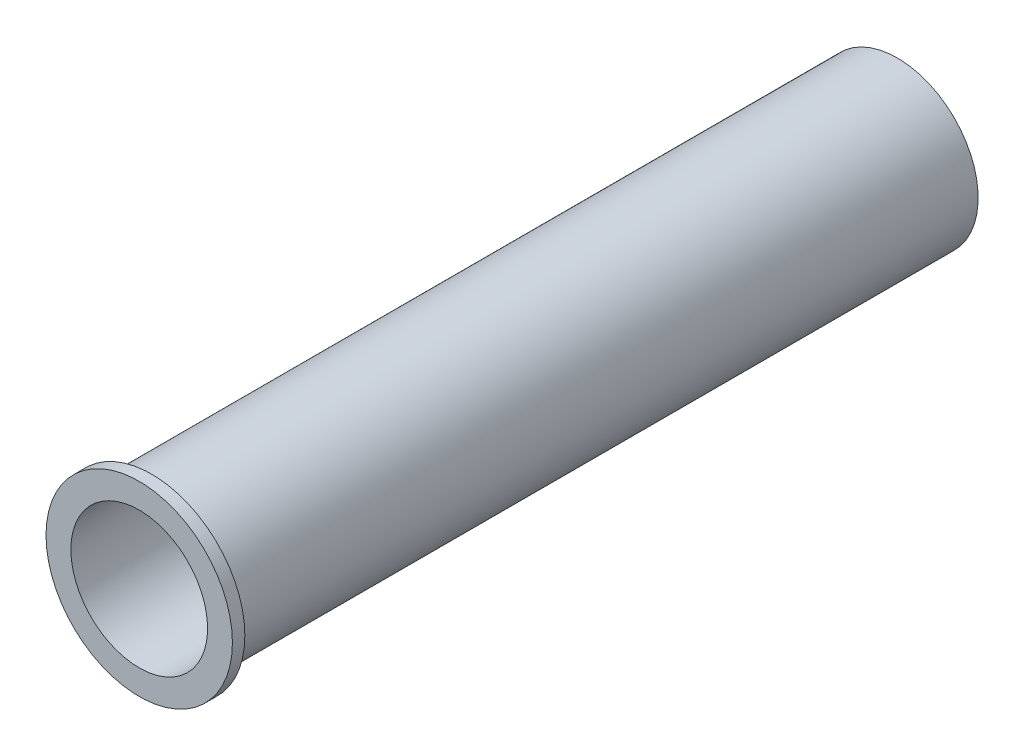
ISO-10303-21;
HEADER;
FILE_DESCRIPTION(('STEP AP214'),'2;1');
FILE_NAME('part.step','',(''),(''),'','','');
FILE_SCHEMA(('AUTOMOTIVE_DESIGN { 1 0 10303 214 1 1 1 1 }'));
ENDSEC;
DATA;
#1=APPLICATION_CONTEXT('core data for automotive mechanical design processes');
#2=APPLICATION_PROTOCOL_DEFINITION('international standard','automotive_design',2000,#1);
#3=PRODUCT_CONTEXT('',#1,'mechanical');
#4=PRODUCT('Part','Part','',(#3));
#5=PRODUCT_RELATED_PRODUCT_CATEGORY('part','',(#4));
#6=PRODUCT_DEFINITION_FORMATION('','',#4);
#7=PRODUCT_DEFINITION_CONTEXT('part definition',#1,'design');
#8=PRODUCT_DEFINITION('design','',#6,#7);
#9=PRODUCT_DEFINITION_SHAPE('','',#8);
#10=(LENGTH_UNIT() NAMED_UNIT(*) SI_UNIT(.MILLI.,.METRE.));
#11=(NAMED_UNIT(*) PLANE_ANGLE_UNIT() SI_UNIT($,.RADIAN.));
#12=(NAMED_UNIT(*) SI_UNIT($,.STERADIAN.) SOLID_ANGLE_UNIT());
#13=UNCERTAINTY_MEASURE_WITH_UNIT(LENGTH_MEASURE(1.E-05),#10,'distance_accuracy_value','');
#14=(GEOMETRIC_REPRESENTATION_CONTEXT(3) GLOBAL_UNCERTAINTY_ASSIGNED_CONTEXT((#13)) GLOBAL_UNIT_ASSIGNED_CONTEXT((#10,
#11,#12)) REPRESENTATION_CONTEXT('',''));
#15=CARTESIAN_POINT('',(0.,0.,0.));
#16=DIRECTION('',(0.,0.,1.));
#17=DIRECTION('',(1.,0.,0.));
#18=AXIS2_PLACEMENT_3D('',#15,#16,#17);
#19=CARTESIAN_POINT('',(0.,0.,0.));
#20=DIRECTION('',(0.,0.,-1.));
#21=DIRECTION('',(-1.,0.,0.));
#22=AXIS2_PLACEMENT_3D('',#19,#20,#21);
#23=CYLINDRICAL_SURFACE('',#22,15.);
#24=CARTESIAN_POINT('',(0.,0.,60.));
#25=DIRECTION('',(0.,0.,-1.));
#26=DIRECTION('',(-1.,0.,0.));
#27=AXIS2_PLACEMENT_3D('',#24,#25,#26);
#28=CIRCLE('',#27,15.);
#29=CARTESIAN_POINT('',(-15.,0.,60.));
#30=VERTEX_POINT('',#29);
#31=EDGE_CURVE('E78',#30,#30,#28,.T.);
#32=ORIENTED_EDGE('',*,*,#31,.T.);
#33=EDGE_LOOP('',(#32));
#34=FACE_BOUND('',#33,.T.);
#35=CARTESIAN_POINT('',(0.,0.,58.));
#36=DIRECTION('',(0.,0.,-1.));
#37=DIRECTION('',(-1.,0.,0.));
#38=AXIS2_PLACEMENT_3D('',#35,#36,#37);
#39=CIRCLE('',#38,15.);
#40=CARTESIAN_POINT('',(-15.,0.,58.));
#41=VERTEX_POINT('',#40);
#42=EDGE_CURVE('E10',#41,#41,#39,.T.);
#43=ORIENTED_EDGE('',*,*,#42,.F.);
#44=EDGE_LOOP('',(#43));
#45=FACE_BOUND('',#44,.T.);
#46=ADVANCED_FACE('F43',(#34,#45),#23,.T.);
#47=CARTESIAN_POINT('',(0.,15.,58.));
#48=DIRECTION('',(0.,0.,-1.));
#49=DIRECTION('',(-1.,0.,0.));
#50=AXIS2_PLACEMENT_3D('',#47,#48,#49);
#51=PLANE('',#50);
#52=ORIENTED_EDGE('',*,*,#42,.T.);
#53=EDGE_LOOP('',(#52));
#54=FACE_BOUND('',#53,.T.);
#55=CARTESIAN_POINT('',(0.,0.,58.));
#56=DIRECTION('',(0.,0.,-1.));
#57=DIRECTION('',(-1.,0.,0.));
#58=AXIS2_PLACEMENT_3D('',#55,#56,#57);
#59=CIRCLE('',#58,13.);
#60=CARTESIAN_POINT('',(-13.,0.,58.));
#61=VERTEX_POINT('',#60);
#62=EDGE_CURVE('E50',#61,#61,#59,.T.);
#63=ORIENTED_EDGE('',*,*,#62,.F.);
#64=EDGE_LOOP('',(#63));
#65=FACE_BOUND('',#64,.T.);
#66=ADVANCED_FACE('F97',(#54,#65),#51,.T.);
#67=CARTESIAN_POINT('',(0.,0.,0.));
#68=DIRECTION('',(0.,0.,-1.));
#69=DIRECTION('',(-1.,0.,0.));
#70=AXIS2_PLACEMENT_3D('',#67,#68,#69);
#71=CYLINDRICAL_SURFACE('',#70,13.);
#72=ORIENTED_EDGE('',*,*,#62,.T.);
#73=EDGE_LOOP('',(#72));
#74=FACE_BOUND('',#73,.T.);
#75=CARTESIAN_POINT('',(0.,0.,-62.));
#76=DIRECTION('',(0.,0.,-1.));
#77=DIRECTION('',(-1.,0.,0.));
#78=AXIS2_PLACEMENT_3D('',#75,#76,#77);
#79=CIRCLE('',#78,13.);
#80=CARTESIAN_POINT('',(-13.,0.,-62.));
#81=VERTEX_POINT('',#80);
#82=EDGE_CURVE('E55',#81,#81,#79,.T.);
#83=ORIENTED_EDGE('',*,*,#82,.F.);
#84=EDGE_LOOP('',(#83));
#85=FACE_BOUND('',#84,.T.);
#86=ADVANCED_FACE('F101',(#74,#85),#71,.T.);
#87=CARTESIAN_POINT('',(0.,13.,-62.));
#88=DIRECTION('',(0.,0.,-1.));
#89=DIRECTION('',(-1.,0.,0.));
#90=AXIS2_PLACEMENT_3D('',#87,#88,#89);
#91=PLANE('',#90);
#92=ORIENTED_EDGE('',*,*,#82,.T.);
#93=EDGE_LOOP('',(#92));
#94=FACE_BOUND('',#93,.T.);
#95=CARTESIAN_POINT('',(0.,0.,-62.));
#96=DIRECTION('',(0.,0.,-1.));
#97=DIRECTION('',(-1.,0.,0.));
#98=AXIS2_PLACEMENT_3D('',#95,#96,#97);
#99=CIRCLE('',#98,9.50000000000001);
#100=CARTESIAN_POINT('',(-9.50000000000001,0.,-62.));
#101=VERTEX_POINT('',#100);
#102=EDGE_CURVE('E60',#101,#101,#99,.T.);
#103=ORIENTED_EDGE('',*,*,#102,.F.);
#104=EDGE_LOOP('',(#103));
#105=FACE_BOUND('',#104,.T.);
#106=ADVANCED_FACE('F105',(#94,#105),#91,.T.);
#107=CARTESIAN_POINT('',(0.,0.,0.));
#108=DIRECTION('',(0.,0.,-1.));
#109=DIRECTION('',(-1.,0.,0.));
#110=AXIS2_PLACEMENT_3D('',#107,#108,#109);
#111=CYLINDRICAL_SURFACE('',#110,9.50000000000001);
#112=ORIENTED_EDGE('',*,*,#102,.T.);
#113=EDGE_LOOP('',(#112));
#114=FACE_BOUND('',#113,.T.);
#115=CARTESIAN_POINT('',(0.,0.,-60.));
#116=DIRECTION('',(0.,0.,-1.));
#117=DIRECTION('',(-1.,0.,0.));
#118=AXIS2_PLACEMENT_3D('',#115,#116,#117);
#119=CIRCLE('',#118,9.50000000000001);
#120=CARTESIAN_POINT('',(-9.50000000000001,0.,-60.));
#121=VERTEX_POINT('',#120);
#122=EDGE_CURVE('E66',#121,#121,#119,.T.);
#123=ORIENTED_EDGE('',*,*,#122,.F.);
#124=EDGE_LOOP('',(#123));
#125=FACE_BOUND('',#124,.T.);
#126=ADVANCED_FACE('F111',(#114,#125),#111,.F.);
#127=CARTESIAN_POINT('',(0.,9.50000000000001,-60.));
#128=DIRECTION('',(0.,0.,1.));
#129=DIRECTION('',(1.,0.,0.));
#130=AXIS2_PLACEMENT_3D('',#127,#128,#129);
#131=PLANE('',#130);
#132=ORIENTED_EDGE('',*,*,#122,.T.);
#133=EDGE_LOOP('',(#132));
#134=FACE_BOUND('',#133,.T.);
#135=CARTESIAN_POINT('',(0.,0.,-60.));
#136=DIRECTION('',(0.,0.,-1.));
#137=DIRECTION('',(-1.,0.,0.));
#138=AXIS2_PLACEMENT_3D('',#135,#136,#137);
#139=CIRCLE('',#138,11.);
#140=CARTESIAN_POINT('',(-11.,0.,-60.));
#141=VERTEX_POINT('',#140);
#142=EDGE_CURVE('E70',#141,#141,#139,.T.);
#143=ORIENTED_EDGE('',*,*,#142,.F.);
#144=EDGE_LOOP('',(#143));
#145=FACE_BOUND('',#144,.T.);
#146=ADVANCED_FACE('F93',(#134,#145),#131,.T.);
#147=CARTESIAN_POINT('',(0.,0.,0.));
#148=DIRECTION('',(0.,0.,-1.));
#149=DIRECTION('',(-1.,0.,0.));
#150=AXIS2_PLACEMENT_3D('',#147,#148,#149);
#151=CYLINDRICAL_SURFACE('',#150,11.);
#152=ORIENTED_EDGE('',*,*,#142,.T.);
#153=EDGE_LOOP('',(#152));
#154=FACE_BOUND('',#153,.T.);
#155=CARTESIAN_POINT('',(0.,0.,60.));
#156=DIRECTION('',(0.,0.,-1.));
#157=DIRECTION('',(-1.,0.,0.));
#158=AXIS2_PLACEMENT_3D('',#155,#156,#157);
#159=CIRCLE('',#158,11.);
#160=CARTESIAN_POINT('',(-11.,0.,60.));
#161=VERTEX_POINT('',#160);
#162=EDGE_CURVE('E74',#161,#161,#159,.T.);
#163=ORIENTED_EDGE('',*,*,#162,.F.);
#164=EDGE_LOOP('',(#163));
#165=FACE_BOUND('',#164,.T.);
#166=ADVANCED_FACE('F87',(#154,#165),#151,.F.);
#167=CARTESIAN_POINT('',(0.,11.,60.));
#168=DIRECTION('',(0.,0.,1.));
#169=DIRECTION('',(1.,0.,0.));
#170=AXIS2_PLACEMENT_3D('',#167,#168,#169);
#171=PLANE('',#170);
#172=ORIENTED_EDGE('',*,*,#162,.T.);
#173=EDGE_LOOP('',(#172));
#174=FACE_BOUND('',#173,.T.);
#175=ORIENTED_EDGE('',*,*,#31,.F.);
#176=EDGE_LOOP('',(#175));
#177=FACE_BOUND('',#176,.T.);
#178=ADVANCED_FACE('F85',(#174,#177),#171,.T.);
#179=CLOSED_SHELL('',(#46,#66,#86,#106,#126,#146,#166,#178));
#180=MANIFOLD_SOLID_BREP('B2',#179);
#181=ADVANCED_BREP_SHAPE_REPRESENTATION('',(#18,#180),#14);
#182=SHAPE_DEFINITION_REPRESENTATION(#9,#181);
ENDSEC;
END-ISO-10303-21;
